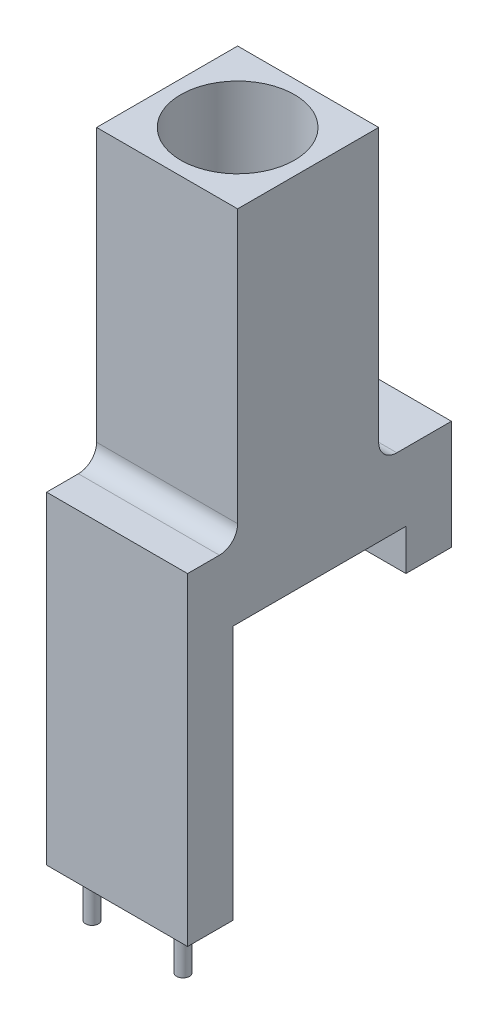
ISO-10303-21;
HEADER;
FILE_DESCRIPTION(('STEP AP214'),'2;1');
FILE_NAME('part.step','',(''),(''),'','','');
FILE_SCHEMA(('AUTOMOTIVE_DESIGN { 1 0 10303 214 1 1 1 1 }'));
ENDSEC;
DATA;
#1=APPLICATION_CONTEXT('core data for automotive mechanical design processes');
#2=APPLICATION_PROTOCOL_DEFINITION('international standard','automotive_design',2000,#1);
#3=PRODUCT_CONTEXT('',#1,'mechanical');
#4=PRODUCT('Part','Part','',(#3));
#5=PRODUCT_RELATED_PRODUCT_CATEGORY('part','',(#4));
#6=PRODUCT_DEFINITION_FORMATION('','',#4);
#7=PRODUCT_DEFINITION_CONTEXT('part definition',#1,'design');
#8=PRODUCT_DEFINITION('design','',#6,#7);
#9=PRODUCT_DEFINITION_SHAPE('','',#8);
#10=(LENGTH_UNIT() NAMED_UNIT(*) SI_UNIT(.MILLI.,.METRE.));
#11=(NAMED_UNIT(*) PLANE_ANGLE_UNIT() SI_UNIT($,.RADIAN.));
#12=(NAMED_UNIT(*) SI_UNIT($,.STERADIAN.) SOLID_ANGLE_UNIT());
#13=UNCERTAINTY_MEASURE_WITH_UNIT(LENGTH_MEASURE(1.E-05),#10,'distance_accuracy_value','');
#14=(GEOMETRIC_REPRESENTATION_CONTEXT(3) GLOBAL_UNCERTAINTY_ASSIGNED_CONTEXT((#13)) GLOBAL_UNIT_ASSIGNED_CONTEXT((#10,
#11,#12)) REPRESENTATION_CONTEXT('',''));
#15=CARTESIAN_POINT('',(0.,0.,0.));
#16=DIRECTION('',(0.,0.,1.));
#17=DIRECTION('',(1.,0.,0.));
#18=AXIS2_PLACEMENT_3D('',#15,#16,#17);
#19=CARTESIAN_POINT('',(15.5,28.5657137141714,-16.));
#20=DIRECTION('',(0.,1.,0.));
#21=DIRECTION('',(0.,0.,1.));
#22=AXIS2_PLACEMENT_3D('',#19,#20,#21);
#23=PLANE('',#22);
#24=DIRECTION('',(-1.,0.,0.));
#25=VECTOR('',#24,1.);
#26=CARTESIAN_POINT('',(-15.5,28.5657137141714,-6.));
#27=LINE('',#26,#25);
#28=CARTESIAN_POINT('',(15.5,28.5657137141714,-6.));
#29=VERTEX_POINT('',#28);
#30=CARTESIAN_POINT('',(-15.5,28.5657137141714,-6.));
#31=VERTEX_POINT('',#30);
#32=EDGE_CURVE('E173',#29,#31,#27,.T.);
#33=ORIENTED_EDGE('',*,*,#32,.F.);
#34=DIRECTION('',(0.,0.,1.));
#35=VECTOR('',#34,1.);
#36=CARTESIAN_POINT('',(15.5,28.5657137141714,-16.));
#37=LINE('',#36,#35);
#38=CARTESIAN_POINT('',(15.5,28.5657137141714,0.));
#39=VERTEX_POINT('',#38);
#40=EDGE_CURVE('E193',#29,#39,#37,.T.);
#41=ORIENTED_EDGE('',*,*,#40,.T.);
#42=DIRECTION('',(-1.,0.,0.));
#43=VECTOR('',#42,1.);
#44=CARTESIAN_POINT('',(15.5,28.5657137141714,0.));
#45=LINE('',#44,#43);
#46=CARTESIAN_POINT('',(-15.5,28.5657137141714,0.));
#47=VERTEX_POINT('',#46);
#48=EDGE_CURVE('E183',#39,#47,#45,.T.);
#49=ORIENTED_EDGE('',*,*,#48,.T.);
#50=DIRECTION('',(0.,0.,1.));
#51=VECTOR('',#50,1.);
#52=CARTESIAN_POINT('',(-15.5,28.5657137141714,-16.));
#53=LINE('',#52,#51);
#54=EDGE_CURVE('E191',#31,#47,#53,.T.);
#55=ORIENTED_EDGE('',*,*,#54,.F.);
#56=EDGE_LOOP('',(#33,#41,#49,#55));
#57=FACE_BOUND('',#56,.T.);
#58=ADVANCED_FACE('F37',(#57),#23,.F.);
#59=CARTESIAN_POINT('',(0.,0.,0.));
#60=DIRECTION('',(0.,0.,1.));
#61=DIRECTION('',(1.,0.,0.));
#62=AXIS2_PLACEMENT_3D('',#59,#60,#61);
#63=PLANE('',#62);
#64=DIRECTION('',(0.,1.,0.));
#65=VECTOR('',#64,1.);
#66=CARTESIAN_POINT('',(15.5,28.5657137141714,0.));
#67=LINE('',#66,#65);
#68=CARTESIAN_POINT('',(15.5,47.5657137141714,0.));
#69=VERTEX_POINT('',#68);
#70=CARTESIAN_POINT('',(15.5,107.5,0.));
#71=VERTEX_POINT('',#70);
#72=EDGE_CURVE('E252',#69,#71,#67,.T.);
#73=ORIENTED_EDGE('',*,*,#72,.F.);
#74=DIRECTION('',(1.,0.,0.));
#75=VECTOR('',#74,1.);
#76=CARTESIAN_POINT('',(-15.5,47.5657137141714,0.));
#77=LINE('',#76,#75);
#78=CARTESIAN_POINT('',(-15.5,47.5657137141714,0.));
#79=VERTEX_POINT('',#78);
#80=EDGE_CURVE('E58',#69,#79,#77,.F.);
#81=ORIENTED_EDGE('',*,*,#80,.T.);
#82=DIRECTION('',(0.,-1.,0.));
#83=VECTOR('',#82,1.);
#84=CARTESIAN_POINT('',(-15.5,107.5,0.));
#85=LINE('',#84,#83);
#86=CARTESIAN_POINT('',(-15.5,107.5,0.));
#87=VERTEX_POINT('',#86);
#88=EDGE_CURVE('E264',#87,#79,#85,.T.);
#89=ORIENTED_EDGE('',*,*,#88,.F.);
#90=DIRECTION('',(-1.,0.,0.));
#91=VECTOR('',#90,1.);
#92=CARTESIAN_POINT('',(15.5,107.5,0.));
#93=LINE('',#92,#91);
#94=EDGE_CURVE('E261',#71,#87,#93,.T.);
#95=ORIENTED_EDGE('',*,*,#94,.F.);
#96=EDGE_LOOP('',(#73,#81,#89,#95));
#97=FACE_BOUND('',#96,.T.);
#98=ADVANCED_FACE('F308',(#97),#63,.F.);
#99=CARTESIAN_POINT('',(-15.5,28.5657137141714,42.));
#100=DIRECTION('',(0.,1.,0.));
#101=DIRECTION('',(0.,0.,1.));
#102=AXIS2_PLACEMENT_3D('',#99,#100,#101);
#103=PLANE('',#102);
#104=DIRECTION('',(1.,0.,0.));
#105=VECTOR('',#104,1.);
#106=CARTESIAN_POINT('',(-15.5,28.5657137141714,32.));
#107=LINE('',#106,#105);
#108=CARTESIAN_POINT('',(-15.5,28.5657137141714,32.));
#109=VERTEX_POINT('',#108);
#110=CARTESIAN_POINT('',(15.5,28.5657137141714,32.));
#111=VERTEX_POINT('',#110);
#112=EDGE_CURVE('E205',#109,#111,#107,.T.);
#113=ORIENTED_EDGE('',*,*,#112,.F.);
#114=DIRECTION('',(0.,0.,-1.));
#115=VECTOR('',#114,1.);
#116=CARTESIAN_POINT('',(-15.5,28.5657137141714,42.));
#117=LINE('',#116,#115);
#118=CARTESIAN_POINT('',(-15.5,28.5657137141714,31.));
#119=VERTEX_POINT('',#118);
#120=EDGE_CURVE('E242',#109,#119,#117,.T.);
#121=ORIENTED_EDGE('',*,*,#120,.T.);
#122=DIRECTION('',(1.,0.,0.));
#123=VECTOR('',#122,1.);
#124=CARTESIAN_POINT('',(-15.5,28.5657137141714,31.));
#125=LINE('',#124,#123);
#126=CARTESIAN_POINT('',(15.5,28.5657137141714,31.));
#127=VERTEX_POINT('',#126);
#128=EDGE_CURVE('E225',#119,#127,#125,.T.);
#129=ORIENTED_EDGE('',*,*,#128,.T.);
#130=DIRECTION('',(0.,0.,-1.));
#131=VECTOR('',#130,1.);
#132=CARTESIAN_POINT('',(15.5,28.5657137141714,42.));
#133=LINE('',#132,#131);
#134=EDGE_CURVE('E240',#111,#127,#133,.T.);
#135=ORIENTED_EDGE('',*,*,#134,.F.);
#136=EDGE_LOOP('',(#113,#121,#129,#135));
#137=FACE_BOUND('',#136,.T.);
#138=ADVANCED_FACE('F302',(#137),#103,.F.);
#139=CARTESIAN_POINT('',(15.5,107.5,31.));
#140=DIRECTION('',(0.,-1.,0.));
#141=DIRECTION('',(0.,0.,-1.));
#142=AXIS2_PLACEMENT_3D('',#139,#140,#141);
#143=PLANE('',#142);
#144=CARTESIAN_POINT('',(0.,107.5,15.5));
#145=DIRECTION('',(0.,1.,0.));
#146=DIRECTION('',(0.,0.,1.));
#147=AXIS2_PLACEMENT_3D('',#144,#145,#146);
#148=CIRCLE('',#147,12.5);
#149=CARTESIAN_POINT('',(0.,107.5,28.));
#150=VERTEX_POINT('',#149);
#151=EDGE_CURVE('E244',#150,#150,#148,.T.);
#152=ORIENTED_EDGE('',*,*,#151,.F.);
#153=EDGE_LOOP('',(#152));
#154=FACE_BOUND('',#153,.T.);
#155=ORIENTED_EDGE('',*,*,#94,.T.);
#156=DIRECTION('',(0.,0.,-1.));
#157=VECTOR('',#156,1.);
#158=CARTESIAN_POINT('',(-15.5,107.5,31.));
#159=LINE('',#158,#157);
#160=CARTESIAN_POINT('',(-15.5,107.5,31.));
#161=VERTEX_POINT('',#160);
#162=EDGE_CURVE('E278',#161,#87,#159,.T.);
#163=ORIENTED_EDGE('',*,*,#162,.F.);
#164=DIRECTION('',(-1.,0.,0.));
#165=VECTOR('',#164,1.);
#166=CARTESIAN_POINT('',(15.5,107.5,31.));
#167=LINE('',#166,#165);
#168=CARTESIAN_POINT('',(15.5,107.5,31.));
#169=VERTEX_POINT('',#168);
#170=EDGE_CURVE('E248',#169,#161,#167,.T.);
#171=ORIENTED_EDGE('',*,*,#170,.F.);
#172=DIRECTION('',(0.,0.,-1.));
#173=VECTOR('',#172,1.);
#174=CARTESIAN_POINT('',(15.5,107.5,31.));
#175=LINE('',#174,#173);
#176=EDGE_CURVE('E260',#169,#71,#175,.T.);
#177=ORIENTED_EDGE('',*,*,#176,.T.);
#178=EDGE_LOOP('',(#155,#163,#171,#177));
#179=FACE_BOUND('',#178,.T.);
#180=ADVANCED_FACE('F384',(#154,#179),#143,.F.);
#181=CARTESIAN_POINT('',(-15.5,107.5,31.));
#182=DIRECTION('',(1.,0.,0.));
#183=DIRECTION('',(0.,1.,0.));
#184=AXIS2_PLACEMENT_3D('',#181,#182,#183);
#185=PLANE('',#184);
#186=ORIENTED_EDGE('',*,*,#88,.T.);
#187=CARTESIAN_POINT('',(-15.5,47.5657137141714,-4.));
#188=DIRECTION('',(1.,0.,0.));
#189=DIRECTION('',(0.,1.,0.));
#190=AXIS2_PLACEMENT_3D('',#187,#188,#189);
#191=CIRCLE('',#190,4.);
#192=CARTESIAN_POINT('',(-15.5,43.5657137141714,-4.));
#193=VERTEX_POINT('',#192);
#194=EDGE_CURVE('E11',#79,#193,#191,.T.);
#195=ORIENTED_EDGE('',*,*,#194,.T.);
#196=DIRECTION('',(0.,0.,1.));
#197=VECTOR('',#196,1.);
#198=CARTESIAN_POINT('',(-15.5,43.5657137141714,-16.));
#199=LINE('',#198,#197);
#200=CARTESIAN_POINT('',(-15.5,43.5657137141714,-16.));
#201=VERTEX_POINT('',#200);
#202=EDGE_CURVE('E155',#201,#193,#199,.T.);
#203=ORIENTED_EDGE('',*,*,#202,.F.);
#204=DIRECTION('',(0.,1.,0.));
#205=VECTOR('',#204,1.);
#206=CARTESIAN_POINT('',(-15.5,28.5657137141714,-16.));
#207=LINE('',#206,#205);
#208=CARTESIAN_POINT('',(-15.5,19.5657137141714,-16.));
#209=VERTEX_POINT('',#208);
#210=EDGE_CURVE('E148',#209,#201,#207,.T.);
#211=ORIENTED_EDGE('',*,*,#210,.F.);
#212=DIRECTION('',(0.,0.,-1.));
#213=VECTOR('',#212,1.);
#214=CARTESIAN_POINT('',(-15.5,19.5657137141714,-16.));
#215=LINE('',#214,#213);
#216=CARTESIAN_POINT('',(-15.5,19.5657137141714,-6.));
#217=VERTEX_POINT('',#216);
#218=EDGE_CURVE('E153',#217,#209,#215,.T.);
#219=ORIENTED_EDGE('',*,*,#218,.F.);
#220=DIRECTION('',(0.,1.,0.));
#221=VECTOR('',#220,1.);
#222=CARTESIAN_POINT('',(-15.5,19.5657137141714,-6.));
#223=LINE('',#222,#221);
#224=EDGE_CURVE('E178',#217,#31,#223,.T.);
#225=ORIENTED_EDGE('',*,*,#224,.T.);
#226=ORIENTED_EDGE('',*,*,#54,.T.);
#227=DIRECTION('',(0.,0.,-1.));
#228=VECTOR('',#227,1.);
#229=CARTESIAN_POINT('',(-15.5,28.5657137141714,31.));
#230=LINE('',#229,#228);
#231=EDGE_CURVE('E275',#119,#47,#230,.T.);
#232=ORIENTED_EDGE('',*,*,#231,.F.);
#233=ORIENTED_EDGE('',*,*,#120,.F.);
#234=DIRECTION('',(0.,1.,0.));
#235=VECTOR('',#234,1.);
#236=CARTESIAN_POINT('',(-15.5,-27.4342862858286,32.));
#237=LINE('',#236,#235);
#238=CARTESIAN_POINT('',(-15.5,-27.4342862858286,32.));
#239=VERTEX_POINT('',#238);
#240=EDGE_CURVE('E223',#239,#109,#237,.T.);
#241=ORIENTED_EDGE('',*,*,#240,.F.);
#242=DIRECTION('',(0.,0.,-1.));
#243=VECTOR('',#242,1.);
#244=CARTESIAN_POINT('',(-15.5,-27.4342862858286,42.));
#245=LINE('',#244,#243);
#246=CARTESIAN_POINT('',(-15.5,-27.4342862858286,42.));
#247=VERTEX_POINT('',#246);
#248=EDGE_CURVE('E208',#247,#239,#245,.T.);
#249=ORIENTED_EDGE('',*,*,#248,.F.);
#250=DIRECTION('',(0.,-1.,0.));
#251=VECTOR('',#250,1.);
#252=CARTESIAN_POINT('',(-15.5,43.5657137141714,42.));
#253=LINE('',#252,#251);
#254=CARTESIAN_POINT('',(-15.5,43.5657137141714,42.));
#255=VERTEX_POINT('',#254);
#256=EDGE_CURVE('E226',#255,#247,#253,.T.);
#257=ORIENTED_EDGE('',*,*,#256,.F.);
#258=DIRECTION('',(0.,0.,-1.));
#259=VECTOR('',#258,1.);
#260=CARTESIAN_POINT('',(-15.5,43.5657137141714,42.));
#261=LINE('',#260,#259);
#262=CARTESIAN_POINT('',(-15.5,43.5657137141714,35.));
#263=VERTEX_POINT('',#262);
#264=EDGE_CURVE('E232',#255,#263,#261,.T.);
#265=ORIENTED_EDGE('',*,*,#264,.T.);
#266=CARTESIAN_POINT('',(-15.5,47.5657137141714,35.));
#267=DIRECTION('',(1.,0.,0.));
#268=DIRECTION('',(0.,1.,0.));
#269=AXIS2_PLACEMENT_3D('',#266,#267,#268);
#270=CIRCLE('',#269,4.);
#271=CARTESIAN_POINT('',(-15.5,47.5657137141714,31.));
#272=VERTEX_POINT('',#271);
#273=EDGE_CURVE('E371',#263,#272,#270,.T.);
#274=ORIENTED_EDGE('',*,*,#273,.T.);
#275=DIRECTION('',(0.,-1.,0.));
#276=VECTOR('',#275,1.);
#277=CARTESIAN_POINT('',(-15.5,107.5,31.));
#278=LINE('',#277,#276);
#279=EDGE_CURVE('E251',#161,#272,#278,.T.);
#280=ORIENTED_EDGE('',*,*,#279,.F.);
#281=ORIENTED_EDGE('',*,*,#162,.T.);
#282=EDGE_LOOP('',(#186,#195,#203,#211,#219,#225,#226,#232,#233,#241,#249,#257,#265,#274,#280,#281));
#283=FACE_BOUND('',#282,.T.);
#284=ADVANCED_FACE('F150',(#283),#185,.F.);
#285=CARTESIAN_POINT('',(0.,0.,31.));
#286=DIRECTION('',(0.,0.,-1.));
#287=DIRECTION('',(-1.,0.,0.));
#288=AXIS2_PLACEMENT_3D('',#285,#286,#287);
#289=CYLINDRICAL_SURFACE('',#288,32.5);
#290=CARTESIAN_POINT('',(0.,32.5,28.));
#291=CARTESIAN_POINT('',(0.337836576797096,32.5000014858481,28.000001993995));
#292=CARTESIAN_POINT('',(0.675646419073798,32.4947211701503,27.9862937420786));
#293=CARTESIAN_POINT('',(1.34870111968519,32.4737482365528,27.9316118089023));
#294=CARTESIAN_POINT('',(1.68394624124221,32.4580567020813,27.8906409646826));
#295=CARTESIAN_POINT('',(2.34934871452611,32.4166882439333,27.7818646195122));
#296=CARTESIAN_POINT('',(2.67950706401439,32.3910133050893,27.7140644525374));
#297=CARTESIAN_POINT('',(3.33247627680054,32.3303591796677,27.5522920170705));
#298=CARTESIAN_POINT('',(3.655286909019,32.2953797009079,27.458318926689));
#299=CARTESIAN_POINT('',(4.29072361432594,32.2171068201874,27.2452866472738));
#300=CARTESIAN_POINT('',(4.60336922914889,32.1738306278612,27.1262793371601));
#301=CARTESIAN_POINT('',(5.21720005388813,32.0800129844634,26.8640755743457));
#302=CARTESIAN_POINT('',(5.51838536540989,32.029471597823,26.7208793361621));
#303=CARTESIAN_POINT('',(6.10753812636798,31.9223688998614,26.4114025835071));
#304=CARTESIAN_POINT('',(6.39550504684375,31.865807347931,26.2451211463047));
#305=CARTESIAN_POINT('',(6.95671971310771,31.7480126441507,25.8905854655627));
#306=CARTESIAN_POINT('',(7.22996167002814,31.6867776775584,25.7023226712112));
#307=CARTESIAN_POINT('',(7.7706537047966,31.5586304930565,25.2972200692385));
#308=CARTESIAN_POINT('',(8.03744733335522,31.4915895245141,25.0795445345004));
#309=CARTESIAN_POINT('',(8.55205593114125,31.3557523561662,24.6230858010536));
#310=CARTESIAN_POINT('',(8.79986216610441,31.2869553677547,24.3842929958416));
#311=CARTESIAN_POINT('',(9.27504004475683,31.1493955036273,23.8870100841506));
#312=CARTESIAN_POINT('',(9.50240511349479,31.0806326459122,23.628513689016));
#313=CARTESIAN_POINT('',(9.93516777355413,30.9450133423428,23.0934696553564));
#314=CARTESIAN_POINT('',(10.140574929647,30.8781560758053,22.8169299616453));
#315=CARTESIAN_POINT('',(10.5361926192171,30.7454705238633,22.2355247309291));
#316=CARTESIAN_POINT('',(10.7254328950547,30.6797972013217,21.929962362477));
#317=CARTESIAN_POINT('',(11.0772837609268,30.5545195371022,21.3028437932912));
#318=CARTESIAN_POINT('',(11.2399052407247,30.4949127174085,20.9812942034822));
#319=CARTESIAN_POINT('',(11.537197149669,30.3836845618775,20.3242192093027));
#320=CARTESIAN_POINT('',(11.6718706236739,30.3320623562946,19.9886953321798));
#321=CARTESIAN_POINT('',(11.9119727513701,30.2385768319002,19.3060217615066));
#322=CARTESIAN_POINT('',(12.0174032216406,30.1967129069289,18.9588727916107));
#323=CARTESIAN_POINT('',(12.1940327024765,30.125806828917,18.2706223819346));
#324=CARTESIAN_POINT('',(12.2665005265636,30.0962937506804,17.9298950679498));
#325=CARTESIAN_POINT('',(12.3828123832685,30.0486260105227,17.242798675196));
#326=CARTESIAN_POINT('',(12.4266571846729,30.0304710435341,16.8964297482112));
#327=CARTESIAN_POINT('',(12.4852075673048,30.0061760528473,16.2009482804609));
#328=CARTESIAN_POINT('',(12.4999242032444,30.0000314709825,15.851836831059));
#329=CARTESIAN_POINT('',(12.5000752025603,29.9999687768108,15.1536139337828));
#330=CARTESIAN_POINT('',(12.4855107857316,30.0060501551928,14.8045024865141));
#331=CARTESIAN_POINT('',(12.429132566831,30.0294439685778,14.1312699315952));
#332=CARTESIAN_POINT('',(12.3891100686744,30.0460177856045,13.8069711336992));
#333=CARTESIAN_POINT('',(12.2839560314935,30.0891616788465,13.1631642014051));
#334=CARTESIAN_POINT('',(12.2188257177663,30.1157312672523,12.8436558340177));
#335=CARTESIAN_POINT('',(12.064070266564,30.1780574892286,12.2115176237259));
#336=CARTESIAN_POINT('',(11.9744423853936,30.2138151518245,11.8988885555344));
#337=CARTESIAN_POINT('',(11.7714864797709,30.293464264234,11.2824886545358));
#338=CARTESIAN_POINT('',(11.6581576468484,30.3373559915053,10.9787181243079));
#339=CARTESIAN_POINT('',(11.4063068130956,30.4329532504431,10.3760489499068));
#340=CARTESIAN_POINT('',(11.2673412010473,30.4847931208213,10.077357163428));
#341=CARTESIAN_POINT('',(10.966727823749,30.5942227078782,9.49258707899246));
#342=CARTESIAN_POINT('',(10.8050717568344,30.6518145267645,9.20651344816111));
#343=CARTESIAN_POINT('',(10.4601861792418,30.7712170242723,8.6485709981369));
#344=CARTESIAN_POINT('',(10.2769543429051,30.8330281573926,8.37670371481884));
#345=CARTESIAN_POINT('',(9.89004205510004,30.9593035374755,7.84857949317793));
#346=CARTESIAN_POINT('',(9.68636062950952,31.0237679107395,7.59232329942892));
#347=CARTESIAN_POINT('',(9.24446718324196,31.1584161029858,7.07904233153633));
#348=CARTESIAN_POINT('',(9.00482867272834,31.2286800574564,6.8232649088032));
#349=CARTESIAN_POINT('',(8.50493372666239,31.3685101409535,6.33273832107719));
#350=CARTESIAN_POINT('',(8.24468559639744,31.4380765384775,6.09798076591755));
#351=CARTESIAN_POINT('',(7.70483283836485,31.5747226511574,5.65071118147546));
#352=CARTESIAN_POINT('',(7.42521665158465,31.6418008440226,5.43821262992373));
#353=CARTESIAN_POINT('',(6.84852311496038,31.771607462917,5.03715940513001));
#354=CARTESIAN_POINT('',(6.55145291574591,31.8343376476115,4.84859502513062));
#355=CARTESIAN_POINT('',(5.93625996496472,31.9548233059178,4.4936797074902));
#356=CARTESIAN_POINT('',(5.61786180256933,32.0124738683296,4.32776979618448));
#357=CARTESIAN_POINT('',(4.96685522977237,32.1199186127321,4.02352681167766));
#358=CARTESIAN_POINT('',(4.63424653718921,32.1697126386216,3.88519428639604));
#359=CARTESIAN_POINT('',(3.95732331030257,32.2599771617885,3.63747776509059));
#360=CARTESIAN_POINT('',(3.61301326443366,32.300451188749,3.52808280744804));
#361=CARTESIAN_POINT('',(2.91521092744542,32.370889364124,3.33931913715329));
#362=CARTESIAN_POINT('',(2.56171921966379,32.4008541784737,3.25994852192951));
#363=CARTESIAN_POINT('',(1.86822654149732,32.4480160606902,3.13566196416776));
#364=CARTESIAN_POINT('',(1.52856560402226,32.4658294122302,3.08907834234039));
#365=CARTESIAN_POINT('',(0.846177822415279,32.4907760537283,3.02396536204923));
#366=CARTESIAN_POINT('',(0.503451092196715,32.4979097388581,3.00543496555238));
#367=CARTESIAN_POINT('',(-0.18234638558213,32.5012971160742,2.99662728409562));
#368=CARTESIAN_POINT('',(-0.525417047665262,32.4975530506074,3.00634417596132));
#369=CARTESIAN_POINT('',(-1.20930851007697,32.4792945740625,3.05391389996297));
#370=CARTESIAN_POINT('',(-1.55012934778272,32.4647803423699,3.09176626348092));
#371=CARTESIAN_POINT('',(-2.21305573781644,32.4261945922102,3.19308386801296));
#372=CARTESIAN_POINT('',(-2.53535633529605,32.4025385760353,3.2554373415451));
#373=CARTESIAN_POINT('',(-3.17330734732858,32.3462927567292,3.40506473925271));
#374=CARTESIAN_POINT('',(-3.48895798981923,32.3137032603453,3.49233780777246));
#375=CARTESIAN_POINT('',(-4.11160846214195,32.2403933537209,3.69104216297893));
#376=CARTESIAN_POINT('',(-4.41860758802012,32.1996722840003,3.80247540914692));
#377=CARTESIAN_POINT('',(-5.0220758323634,32.1110849542513,4.04858300475126));
#378=CARTESIAN_POINT('',(-5.31854459692326,32.0632184543593,4.18325813441326));
#379=CARTESIAN_POINT('',(-5.90788780672696,31.9599593197607,4.4791657077339));
#380=CARTESIAN_POINT('',(-6.20039403196736,31.9043853909989,4.64106807003787));
#381=CARTESIAN_POINT('',(-6.77089024325919,31.7882027513973,4.98732028569481));
#382=CARTESIAN_POINT('',(-7.04887479299824,31.7275921767349,5.17167846073493));
#383=CARTESIAN_POINT('',(-7.5887545349965,31.6028097457927,5.56160479328448));
#384=CARTESIAN_POINT('',(-7.85064743289137,31.5386373841408,5.76717596422032));
#385=CARTESIAN_POINT('',(-8.35693289915545,31.4082794568399,6.19826757178262));
#386=CARTESIAN_POINT('',(-8.60132478091287,31.3420938123494,6.42378879032791));
#387=CARTESIAN_POINT('',(-9.0857504740377,31.2052290218407,6.90794067673282));
#388=CARTESIAN_POINT('',(-9.3245965278678,31.1345233678042,7.16775387326328));
#389=CARTESIAN_POINT('',(-9.77955606416925,30.9946272278478,7.70675842068411));
#390=CARTESIAN_POINT('',(-9.99567902379111,30.9254361198645,7.98594161161521));
#391=CARTESIAN_POINT('',(-10.4040109365392,30.7904666087189,8.5623232137296));
#392=CARTESIAN_POINT('',(-10.5962059566684,30.7246902067803,8.85953197262626));
#393=CARTESIAN_POINT('',(-10.9550625967691,30.598574740042,9.46991856158089));
#394=CARTESIAN_POINT('',(-11.1217351197363,30.5382333580096,9.78308949609661));
#395=CARTESIAN_POINT('',(-11.4292730930952,30.4244768010409,10.4256161603052));
#396=CARTESIAN_POINT('',(-11.5699665785565,30.3711084179073,10.7550626333341));
#397=CARTESIAN_POINT('',(-11.8229161820429,30.2735371507908,11.4260351589831));
#398=CARTESIAN_POINT('',(-11.9351719982129,30.2293343640982,11.7675613397809));
#399=CARTESIAN_POINT('',(-12.1300251663235,30.1516749468945,12.4599734163671));
#400=CARTESIAN_POINT('',(-12.2126389587628,30.1182123605837,12.8108540074911));
#401=CARTESIAN_POINT('',(-12.347347462325,30.0632388267647,13.5193422493093));
#402=CARTESIAN_POINT('',(-12.3994444593826,30.0417269840631,13.876949394063));
#403=CARTESIAN_POINT('',(-12.4700355860757,30.0124899541665,14.5716686201911));
#404=CARTESIAN_POINT('',(-12.4905540874282,30.0039348248892,14.9085414958595));
#405=CARTESIAN_POINT('',(-12.5042733999444,29.9982201271177,15.5829323221159));
#406=CARTESIAN_POINT('',(-12.4974754902856,30.0010600250152,15.9204502417579));
#407=CARTESIAN_POINT('',(-12.4566410320723,30.0180375072707,16.5935076797743));
#408=CARTESIAN_POINT('',(-12.4226072060802,30.0321739623997,16.9290473925175));
#409=CARTESIAN_POINT('',(-12.3276744203618,30.0712665333475,17.5956596040771));
#410=CARTESIAN_POINT('',(-12.2667755151395,30.0962226272155,17.9267321119551));
#411=CARTESIAN_POINT('',(-12.1212692462898,30.1551116456071,18.5708494113773));
#412=CARTESIAN_POINT('',(-12.0375402984542,30.1887097692855,18.8841241132371));
#413=CARTESIAN_POINT('',(-11.8463246437013,30.2642553807919,19.5024173941431));
#414=CARTESIAN_POINT('',(-11.7388294874756,30.3062058374936,19.8074329935344));
#415=CARTESIAN_POINT('',(-11.501003763072,30.3972549424326,20.4072374016636));
#416=CARTESIAN_POINT('',(-11.3706779063604,30.4463521154822,20.7020283054172));
#417=CARTESIAN_POINT('',(-11.0880766958676,30.5504046976091,21.2799725025733));
#418=CARTESIAN_POINT('',(-10.9357913603118,30.6053627678072,21.5631204279804));
#419=CARTESIAN_POINT('',(-10.6014757544643,30.7228217147294,22.1312259001551));
#420=CARTESIAN_POINT('',(-10.4182790286402,30.7855701603389,22.4154461547296));
#421=CARTESIAN_POINT('',(-10.0299458981895,30.9142685538483,22.9675332775858));
#422=CARTESIAN_POINT('',(-9.82481763482346,30.9802173088228,23.2354061566135));
#423=CARTESIAN_POINT('',(-9.39365602037941,31.113665404182,23.7536610585337));
#424=CARTESIAN_POINT('',(-9.16760890820722,31.1811657429909,24.0040313748607));
#425=CARTESIAN_POINT('',(-8.696082385407,31.3159424571287,24.4856379580709));
#426=CARTESIAN_POINT('',(-8.45060949727746,31.3832188997944,24.7168805944731));
#427=CARTESIAN_POINT('',(-7.92660987150273,31.5197772050651,25.1719275168523));
#428=CARTESIAN_POINT('',(-7.64699001785467,31.5889467722863,25.3945089625188));
#429=CARTESIAN_POINT('',(-7.0690734930213,31.7232753869772,25.8153271264768));
#430=CARTESIAN_POINT('',(-6.77077634855599,31.7884343327354,26.0135632274834));
#431=CARTESIAN_POINT('',(-6.15729613308856,31.9129388230043,26.3842156738373));
#432=CARTESIAN_POINT('',(-5.84210974945129,31.9722832205527,26.556626928576));
#433=CARTESIAN_POINT('',(-5.19697196812804,32.0834633977846,26.8741259529693));
#434=CARTESIAN_POINT('',(-4.86702007342906,32.1352989244674,27.0192128020161));
#435=CARTESIAN_POINT('',(-4.17264073325585,32.2330552453392,27.2892638928707));
#436=CARTESIAN_POINT('',(-3.80737026888949,32.2783668866657,27.4122896453467));
#437=CARTESIAN_POINT('',(-3.06581046120039,32.3572222779021,27.624336296155));
#438=CARTESIAN_POINT('',(-2.68952032228379,32.3907651758565,27.7133547326927));
#439=CARTESIAN_POINT('',(-1.9295825115482,32.444903163824,27.8562176902785));
#440=CARTESIAN_POINT('',(-1.54593846561329,32.4655044737244,27.9100791087115));
#441=CARTESIAN_POINT('',(-0.774850858737181,32.4930510592465,27.9819665469636));
#442=CARTESIAN_POINT('',(-0.387407851512583,32.4999982961312,27.9999977134231));
#443=CARTESIAN_POINT('',(0.,32.5,28.));
#444=B_SPLINE_CURVE_WITH_KNOTS('',3,(#290,#291,#292,#293,#294,#295,#296,#297,#298,#299,#300,
#301,#302,#303,#304,#305,#306,#307,#308,#309,#310,#311,#312,#313,#314,#315,#316,#317,#318,#319,
#320,#321,#322,#323,#324,#325,#326,#327,#328,#329,#330,#331,#332,#333,#334,#335,#336,#337,#338,
#339,#340,#341,#342,#343,#344,#345,#346,#347,#348,#349,#350,#351,#352,#353,#354,#355,#356,#357,
#358,#359,#360,#361,#362,#363,#364,#365,#366,#367,#368,#369,#370,#371,#372,#373,#374,#375,#376,
#377,#378,#379,#380,#381,#382,#383,#384,#385,#386,#387,#388,#389,#390,#391,#392,#393,#394,#395,
#396,#397,#398,#399,#400,#401,#402,#403,#404,#405,#406,#407,#408,#409,#410,#411,#412,#413,#414,
#415,#416,#417,#418,#419,#420,#421,#422,#423,#424,#425,#426,#427,#428,#429,#430,#431,#432,#433,
#434,#435,#436,#437,#438,#439,#440,#441,#442,#443),.UNSPECIFIED.,.T.,.F.,(4,2,2,2,2,2,2,2,2,2,2,
2,2,2,2,2,2,2,2,2,2,2,2,2,2,2,2,2,2,2,2,2,2,2,2,2,2,2,2,2,2,2,2,2,2,2,2,2,2,2,2,2,2,2,2,2,2,2,2,
2,2,2,2,2,2,2,2,2,2,2,2,2,2,2,2,2,4),(0.,1.01314595975048,2.02618650449893,3.03902574631696,
4.05189679717286,5.06268917606959,6.07347259133179,7.08429641992878,8.09551478028225,
9.14672589398078,10.1984177008507,11.2504465856736,12.3020153277499,13.3967609426597,
14.4910575711259,15.5852349163197,16.6793442758452,17.726762896864,18.7741533840765,
19.82114628971,20.8680955804434,21.8484829808636,22.8288225430416,23.809271946983,
24.789754800777,25.7891419927472,26.7888957841688,27.7887574381648,28.7886667434743,
29.8598534845726,30.9306107330479,32.0020126176474,33.0729785859505,34.1624833832819,
35.2520098252111,36.3411229590213,37.4301670667424,38.4587723565712,39.4873395847373,
40.5156947889557,41.5440328655077,42.5302803600795,43.5164939942756,44.5027876440464,
45.4891144099522,46.5047330614098,47.5207292330266,48.5368699318705,49.5530504748226,
50.6315897362553,51.709677370463,52.7883898569161,53.8666402331481,54.9517903605402,
56.0369520059121,57.1215108490711,58.2059884403217,59.2175271330167,60.2290184577633,
61.2404086842304,62.2517968587977,63.2287277896937,64.2060065969525,65.1830839647583,
66.1606068755155,67.1912327772456,68.2214774174347,69.252404669877,70.2829872297012,
71.3737490421794,72.4645385056074,73.5555427039186,74.6465836535307,75.8090320001179,
76.9715644805817,78.1335378052259,79.2953442125035),.UNSPECIFIED.);
#445=CARTESIAN_POINT('',(0.,32.5,28.));
#446=VERTEX_POINT('',#445);
#447=EDGE_CURVE('E247',#446,#446,#444,.T.);
#448=ORIENTED_EDGE('',*,*,#447,.T.);
#449=EDGE_LOOP('',(#448));
#450=FACE_BOUND('',#449,.T.);
#451=CARTESIAN_POINT('',(0.,0.,0.));
#452=DIRECTION('',(0.,0.,-1.));
#453=DIRECTION('',(1.,0.,0.));
#454=AXIS2_PLACEMENT_3D('',#451,#452,#453);
#455=CIRCLE('',#454,32.5);
#456=EDGE_CURVE('E266',#47,#39,#455,.T.);
#457=ORIENTED_EDGE('',*,*,#456,.T.);
#458=DIRECTION('',(0.,0.,-1.));
#459=VECTOR('',#458,1.);
#460=CARTESIAN_POINT('',(15.5,28.5657137141714,31.));
#461=LINE('',#460,#459);
#462=EDGE_CURVE('E272',#127,#39,#461,.T.);
#463=ORIENTED_EDGE('',*,*,#462,.F.);
#464=CARTESIAN_POINT('',(0.,0.,31.));
#465=DIRECTION('',(0.,0.,-1.));
#466=DIRECTION('',(1.,0.,0.));
#467=AXIS2_PLACEMENT_3D('',#464,#465,#466);
#468=CIRCLE('',#467,32.5);
#469=EDGE_CURVE('E255',#119,#127,#468,.T.);
#470=ORIENTED_EDGE('',*,*,#469,.F.);
#471=ORIENTED_EDGE('',*,*,#231,.T.);
#472=EDGE_LOOP('',(#457,#463,#470,#471));
#473=FACE_BOUND('',#472,.T.);
#474=ADVANCED_FACE('F290',(#450,#473),#289,.F.);
#475=CARTESIAN_POINT('',(15.5,28.5657137141714,31.));
#476=DIRECTION('',(-1.,0.,0.));
#477=DIRECTION('',(0.,-1.,0.));
#478=AXIS2_PLACEMENT_3D('',#475,#476,#477);
#479=PLANE('',#478);
#480=ORIENTED_EDGE('',*,*,#462,.T.);
#481=ORIENTED_EDGE('',*,*,#40,.F.);
#482=DIRECTION('',(0.,1.,0.));
#483=VECTOR('',#482,1.);
#484=CARTESIAN_POINT('',(15.5,19.5657137141714,-6.));
#485=LINE('',#484,#483);
#486=CARTESIAN_POINT('',(15.5,19.5657137141714,-6.));
#487=VERTEX_POINT('',#486);
#488=EDGE_CURVE('E181',#487,#29,#485,.T.);
#489=ORIENTED_EDGE('',*,*,#488,.F.);
#490=DIRECTION('',(0.,0.,1.));
#491=VECTOR('',#490,1.);
#492=CARTESIAN_POINT('',(15.5,19.5657137141714,-16.));
#493=LINE('',#492,#491);
#494=CARTESIAN_POINT('',(15.5,19.5657137141714,-16.));
#495=VERTEX_POINT('',#494);
#496=EDGE_CURVE('E167',#495,#487,#493,.T.);
#497=ORIENTED_EDGE('',*,*,#496,.F.);
#498=DIRECTION('',(0.,-1.,0.));
#499=VECTOR('',#498,1.);
#500=CARTESIAN_POINT('',(15.5,28.5657137141714,-16.));
#501=LINE('',#500,#499);
#502=CARTESIAN_POINT('',(15.5,43.5657137141714,-16.));
#503=VERTEX_POINT('',#502);
#504=EDGE_CURVE('E159',#503,#495,#501,.T.);
#505=ORIENTED_EDGE('',*,*,#504,.F.);
#506=DIRECTION('',(0.,0.,1.));
#507=VECTOR('',#506,1.);
#508=CARTESIAN_POINT('',(15.5,43.5657137141714,-16.));
#509=LINE('',#508,#507);
#510=CARTESIAN_POINT('',(15.5,43.5657137141714,-4.));
#511=VERTEX_POINT('',#510);
#512=EDGE_CURVE('E186',#503,#511,#509,.T.);
#513=ORIENTED_EDGE('',*,*,#512,.T.);
#514=CARTESIAN_POINT('',(15.5,47.5657137141714,-4.));
#515=DIRECTION('',(-1.,0.,0.));
#516=DIRECTION('',(0.,-1.,0.));
#517=AXIS2_PLACEMENT_3D('',#514,#515,#516);
#518=CIRCLE('',#517,4.);
#519=EDGE_CURVE('E45',#511,#69,#518,.T.);
#520=ORIENTED_EDGE('',*,*,#519,.T.);
#521=ORIENTED_EDGE('',*,*,#72,.T.);
#522=ORIENTED_EDGE('',*,*,#176,.F.);
#523=DIRECTION('',(0.,1.,0.));
#524=VECTOR('',#523,1.);
#525=CARTESIAN_POINT('',(15.5,28.5657137141714,31.));
#526=LINE('',#525,#524);
#527=CARTESIAN_POINT('',(15.5,47.5657137141714,31.));
#528=VERTEX_POINT('',#527);
#529=EDGE_CURVE('E258',#528,#169,#526,.T.);
#530=ORIENTED_EDGE('',*,*,#529,.F.);
#531=CARTESIAN_POINT('',(15.5,47.5657137141714,35.));
#532=DIRECTION('',(-1.,0.,0.));
#533=DIRECTION('',(0.,-1.,0.));
#534=AXIS2_PLACEMENT_3D('',#531,#532,#533);
#535=CIRCLE('',#534,4.);
#536=CARTESIAN_POINT('',(15.5,43.5657137141714,35.));
#537=VERTEX_POINT('',#536);
#538=EDGE_CURVE('E370',#528,#537,#535,.T.);
#539=ORIENTED_EDGE('',*,*,#538,.T.);
#540=DIRECTION('',(0.,0.,-1.));
#541=VECTOR('',#540,1.);
#542=CARTESIAN_POINT('',(15.5,43.5657137141714,42.));
#543=LINE('',#542,#541);
#544=CARTESIAN_POINT('',(15.5,43.5657137141714,42.));
#545=VERTEX_POINT('',#544);
#546=EDGE_CURVE('E237',#545,#537,#543,.T.);
#547=ORIENTED_EDGE('',*,*,#546,.F.);
#548=DIRECTION('',(0.,1.,0.));
#549=VECTOR('',#548,1.);
#550=CARTESIAN_POINT('',(15.5,43.5657137141714,42.));
#551=LINE('',#550,#549);
#552=CARTESIAN_POINT('',(15.5,-27.4342862858286,42.));
#553=VERTEX_POINT('',#552);
#554=EDGE_CURVE('E228',#553,#545,#551,.T.);
#555=ORIENTED_EDGE('',*,*,#554,.F.);
#556=DIRECTION('',(0.,0.,1.));
#557=VECTOR('',#556,1.);
#558=CARTESIAN_POINT('',(15.5,-27.4342862858286,42.));
#559=LINE('',#558,#557);
#560=CARTESIAN_POINT('',(15.5,-27.4342862858286,32.));
#561=VERTEX_POINT('',#560);
#562=EDGE_CURVE('E213',#561,#553,#559,.T.);
#563=ORIENTED_EDGE('',*,*,#562,.F.);
#564=DIRECTION('',(0.,1.,0.));
#565=VECTOR('',#564,1.);
#566=CARTESIAN_POINT('',(15.5,-27.4342862858286,32.));
#567=LINE('',#566,#565);
#568=EDGE_CURVE('E219',#561,#111,#567,.T.);
#569=ORIENTED_EDGE('',*,*,#568,.T.);
#570=ORIENTED_EDGE('',*,*,#134,.T.);
#571=EDGE_LOOP('',(#480,#481,#489,#497,#505,#513,#520,#521,#522,#530,#539,#547,#555,#563,#569,#570));
#572=FACE_BOUND('',#571,.T.);
#573=ADVANCED_FACE('F306',(#572),#479,.F.);
#574=CARTESIAN_POINT('',(0.,0.,31.));
#575=DIRECTION('',(0.,0.,1.));
#576=DIRECTION('',(1.,0.,0.));
#577=AXIS2_PLACEMENT_3D('',#574,#575,#576);
#578=PLANE('',#577);
#579=ORIENTED_EDGE('',*,*,#279,.T.);
#580=DIRECTION('',(-1.,0.,0.));
#581=VECTOR('',#580,1.);
#582=CARTESIAN_POINT('',(0.,47.5657137141714,31.));
#583=LINE('',#582,#581);
#584=EDGE_CURVE('E372',#272,#528,#583,.F.);
#585=ORIENTED_EDGE('',*,*,#584,.T.);
#586=ORIENTED_EDGE('',*,*,#529,.T.);
#587=ORIENTED_EDGE('',*,*,#170,.T.);
#588=EDGE_LOOP('',(#579,#585,#586,#587));
#589=FACE_BOUND('',#588,.T.);
#590=ADVANCED_FACE('F300',(#589),#578,.T.);
#591=CARTESIAN_POINT('',(0.,28.5657137141714,15.5));
#592=DIRECTION('',(0.,1.,0.));
#593=DIRECTION('',(0.,0.,1.));
#594=AXIS2_PLACEMENT_3D('',#591,#592,#593);
#595=CYLINDRICAL_SURFACE('',#594,12.5);
#596=ORIENTED_EDGE('',*,*,#151,.T.);
#597=EDGE_LOOP('',(#596));
#598=FACE_BOUND('',#597,.T.);
#599=ORIENTED_EDGE('',*,*,#447,.F.);
#600=EDGE_LOOP('',(#599));
#601=FACE_BOUND('',#600,.T.);
#602=ADVANCED_FACE('F294',(#598,#601),#595,.F.);
#603=CARTESIAN_POINT('',(0.,0.,31.));
#604=DIRECTION('',(0.,0.,1.));
#605=DIRECTION('',(1.,0.,0.));
#606=AXIS2_PLACEMENT_3D('',#603,#604,#605);
#607=PLANE('',#606);
#608=ORIENTED_EDGE('',*,*,#128,.F.);
#609=ORIENTED_EDGE('',*,*,#469,.T.);
#610=EDGE_LOOP('',(#608,#609));
#611=FACE_BOUND('',#610,.T.);
#612=ADVANCED_FACE('F299',(#611),#607,.F.);
#613=CARTESIAN_POINT('',(-15.5,43.5657137141714,42.));
#614=DIRECTION('',(0.,-1.,0.));
#615=DIRECTION('',(0.,0.,-1.));
#616=AXIS2_PLACEMENT_3D('',#613,#614,#615);
#617=PLANE('',#616);
#618=ORIENTED_EDGE('',*,*,#546,.T.);
#619=DIRECTION('',(-1.,0.,0.));
#620=VECTOR('',#619,1.);
#621=CARTESIAN_POINT('',(-15.5,43.5657137141714,35.));
#622=LINE('',#621,#620);
#623=EDGE_CURVE('E281',#537,#263,#622,.T.);
#624=ORIENTED_EDGE('',*,*,#623,.T.);
#625=ORIENTED_EDGE('',*,*,#264,.F.);
#626=DIRECTION('',(-1.,0.,0.));
#627=VECTOR('',#626,1.);
#628=CARTESIAN_POINT('',(-15.5,43.5657137141714,42.));
#629=LINE('',#628,#627);
#630=EDGE_CURVE('E230',#545,#255,#629,.T.);
#631=ORIENTED_EDGE('',*,*,#630,.F.);
#632=EDGE_LOOP('',(#618,#624,#625,#631));
#633=FACE_BOUND('',#632,.T.);
#634=ADVANCED_FACE('F353',(#633),#617,.F.);
#635=CARTESIAN_POINT('',(0.,0.,42.));
#636=DIRECTION('',(0.,0.,1.));
#637=DIRECTION('',(1.,0.,0.));
#638=AXIS2_PLACEMENT_3D('',#635,#636,#637);
#639=PLANE('',#638);
#640=ORIENTED_EDGE('',*,*,#256,.T.);
#641=DIRECTION('',(-1.,0.,0.));
#642=VECTOR('',#641,1.);
#643=CARTESIAN_POINT('',(-15.5,-27.4342862858286,42.));
#644=LINE('',#643,#642);
#645=EDGE_CURVE('E216',#553,#247,#644,.T.);
#646=ORIENTED_EDGE('',*,*,#645,.F.);
#647=ORIENTED_EDGE('',*,*,#554,.T.);
#648=ORIENTED_EDGE('',*,*,#630,.T.);
#649=EDGE_LOOP('',(#640,#646,#647,#648));
#650=FACE_BOUND('',#649,.T.);
#651=ADVANCED_FACE('F349',(#650),#639,.T.);
#652=CARTESIAN_POINT('',(-15.5,-27.4342862858286,32.));
#653=DIRECTION('',(0.,0.,1.));
#654=DIRECTION('',(1.,0.,0.));
#655=AXIS2_PLACEMENT_3D('',#652,#653,#654);
#656=PLANE('',#655);
#657=ORIENTED_EDGE('',*,*,#112,.T.);
#658=ORIENTED_EDGE('',*,*,#568,.F.);
#659=DIRECTION('',(1.,0.,0.));
#660=VECTOR('',#659,1.);
#661=CARTESIAN_POINT('',(-15.5,-27.4342862858286,32.));
#662=LINE('',#661,#660);
#663=EDGE_CURVE('E211',#239,#561,#662,.T.);
#664=ORIENTED_EDGE('',*,*,#663,.F.);
#665=ORIENTED_EDGE('',*,*,#240,.T.);
#666=EDGE_LOOP('',(#657,#658,#664,#665));
#667=FACE_BOUND('',#666,.T.);
#668=ADVANCED_FACE('F345',(#667),#656,.F.);
#669=CARTESIAN_POINT('',(0.,-27.4342862858286,0.));
#670=DIRECTION('',(0.,-1.,0.));
#671=DIRECTION('',(0.,0.,-1.));
#672=AXIS2_PLACEMENT_3D('',#669,#670,#671);
#673=PLANE('',#672);
#674=CARTESIAN_POINT('',(10.,-27.4342862858286,37.5));
#675=DIRECTION('',(0.,-1.,0.));
#676=DIRECTION('',(0.,0.,-1.));
#677=AXIS2_PLACEMENT_3D('',#674,#675,#676);
#678=CIRCLE('',#677,1.4);
#679=CARTESIAN_POINT('',(10.,-27.4342862858286,36.1));
#680=VERTEX_POINT('',#679);
#681=EDGE_CURVE('E196',#680,#680,#678,.T.);
#682=ORIENTED_EDGE('',*,*,#681,.F.);
#683=EDGE_LOOP('',(#682));
#684=FACE_BOUND('',#683,.T.);
#685=CARTESIAN_POINT('',(-10.,-27.4342862858286,37.5));
#686=DIRECTION('',(0.,-1.,0.));
#687=DIRECTION('',(0.,0.,-1.));
#688=AXIS2_PLACEMENT_3D('',#685,#686,#687);
#689=CIRCLE('',#688,1.4);
#690=CARTESIAN_POINT('',(-10.,-27.4342862858286,36.1));
#691=VERTEX_POINT('',#690);
#692=EDGE_CURVE('E199',#691,#691,#689,.T.);
#693=ORIENTED_EDGE('',*,*,#692,.F.);
#694=EDGE_LOOP('',(#693));
#695=FACE_BOUND('',#694,.T.);
#696=ORIENTED_EDGE('',*,*,#248,.T.);
#697=ORIENTED_EDGE('',*,*,#663,.T.);
#698=ORIENTED_EDGE('',*,*,#562,.T.);
#699=ORIENTED_EDGE('',*,*,#645,.T.);
#700=EDGE_LOOP('',(#696,#697,#698,#699));
#701=FACE_BOUND('',#700,.T.);
#702=ADVANCED_FACE('F341',(#684,#695,#701),#673,.T.);
#703=CARTESIAN_POINT('',(-10.,-37.4342862858286,37.5));
#704=DIRECTION('',(0.,1.,0.));
#705=DIRECTION('',(0.,0.,1.));
#706=AXIS2_PLACEMENT_3D('',#703,#704,#705);
#707=CYLINDRICAL_SURFACE('',#706,1.4);
#708=CARTESIAN_POINT('',(-10.,-37.4342862858286,37.5));
#709=DIRECTION('',(0.,-1.,0.));
#710=DIRECTION('',(0.,0.,-1.));
#711=AXIS2_PLACEMENT_3D('',#708,#709,#710);
#712=CIRCLE('',#711,1.4);
#713=CARTESIAN_POINT('',(-10.,-37.4342862858286,36.1));
#714=VERTEX_POINT('',#713);
#715=EDGE_CURVE('E202',#714,#714,#712,.T.);
#716=ORIENTED_EDGE('',*,*,#715,.F.);
#717=EDGE_LOOP('',(#716));
#718=FACE_BOUND('',#717,.T.);
#719=ORIENTED_EDGE('',*,*,#692,.T.);
#720=EDGE_LOOP('',(#719));
#721=FACE_BOUND('',#720,.T.);
#722=ADVANCED_FACE('F337',(#718,#721),#707,.T.);
#723=CARTESIAN_POINT('',(-10.,-37.4342862858286,37.5));
#724=DIRECTION('',(0.,-1.,0.));
#725=DIRECTION('',(0.,0.,-1.));
#726=AXIS2_PLACEMENT_3D('',#723,#724,#725);
#727=PLANE('',#726);
#728=ORIENTED_EDGE('',*,*,#715,.T.);
#729=EDGE_LOOP('',(#728));
#730=FACE_BOUND('',#729,.T.);
#731=ADVANCED_FACE('F329',(#730),#727,.T.);
#732=CARTESIAN_POINT('',(10.,-37.4342862858286,37.5));
#733=DIRECTION('',(0.,1.,0.));
#734=DIRECTION('',(0.,0.,1.));
#735=AXIS2_PLACEMENT_3D('',#732,#733,#734);
#736=CYLINDRICAL_SURFACE('',#735,1.4);
#737=CARTESIAN_POINT('',(10.,-37.4342862858286,37.5));
#738=DIRECTION('',(0.,-1.,0.));
#739=DIRECTION('',(0.,0.,-1.));
#740=AXIS2_PLACEMENT_3D('',#737,#738,#739);
#741=CIRCLE('',#740,1.4);
#742=CARTESIAN_POINT('',(10.,-37.4342862858286,36.1));
#743=VERTEX_POINT('',#742);
#744=EDGE_CURVE('E195',#743,#743,#741,.T.);
#745=ORIENTED_EDGE('',*,*,#744,.F.);
#746=EDGE_LOOP('',(#745));
#747=FACE_BOUND('',#746,.T.);
#748=ORIENTED_EDGE('',*,*,#681,.T.);
#749=EDGE_LOOP('',(#748));
#750=FACE_BOUND('',#749,.T.);
#751=ADVANCED_FACE('F325',(#747,#750),#736,.T.);
#752=CARTESIAN_POINT('',(10.,-37.4342862858286,37.5));
#753=DIRECTION('',(0.,-1.,0.));
#754=DIRECTION('',(0.,0.,-1.));
#755=AXIS2_PLACEMENT_3D('',#752,#753,#754);
#756=PLANE('',#755);
#757=ORIENTED_EDGE('',*,*,#744,.T.);
#758=EDGE_LOOP('',(#757));
#759=FACE_BOUND('',#758,.T.);
#760=ADVANCED_FACE('F328',(#759),#756,.T.);
#761=CARTESIAN_POINT('',(0.,0.,0.));
#762=DIRECTION('',(0.,0.,1.));
#763=DIRECTION('',(1.,0.,0.));
#764=AXIS2_PLACEMENT_3D('',#761,#762,#763);
#765=PLANE('',#764);
#766=ORIENTED_EDGE('',*,*,#456,.F.);
#767=ORIENTED_EDGE('',*,*,#48,.F.);
#768=EDGE_LOOP('',(#766,#767));
#769=FACE_BOUND('',#768,.T.);
#770=ADVANCED_FACE('F333',(#769),#765,.T.);
#771=CARTESIAN_POINT('',(15.5,43.5657137141714,-16.));
#772=DIRECTION('',(0.,-1.,0.));
#773=DIRECTION('',(0.,0.,-1.));
#774=AXIS2_PLACEMENT_3D('',#771,#772,#773);
#775=PLANE('',#774);
#776=ORIENTED_EDGE('',*,*,#202,.T.);
#777=DIRECTION('',(1.,0.,0.));
#778=VECTOR('',#777,1.);
#779=CARTESIAN_POINT('',(15.5,43.5657137141714,-4.));
#780=LINE('',#779,#778);
#781=EDGE_CURVE('E373',#193,#511,#780,.T.);
#782=ORIENTED_EDGE('',*,*,#781,.T.);
#783=ORIENTED_EDGE('',*,*,#512,.F.);
#784=DIRECTION('',(1.,0.,0.));
#785=VECTOR('',#784,1.);
#786=CARTESIAN_POINT('',(15.5,43.5657137141714,-16.));
#787=LINE('',#786,#785);
#788=EDGE_CURVE('E158',#201,#503,#787,.T.);
#789=ORIENTED_EDGE('',*,*,#788,.F.);
#790=EDGE_LOOP('',(#776,#782,#783,#789));
#791=FACE_BOUND('',#790,.T.);
#792=ADVANCED_FACE('F323',(#791),#775,.F.);
#793=CARTESIAN_POINT('',(0.,0.,-16.));
#794=DIRECTION('',(0.,0.,1.));
#795=DIRECTION('',(1.,0.,0.));
#796=AXIS2_PLACEMENT_3D('',#793,#794,#795);
#797=PLANE('',#796);
#798=ORIENTED_EDGE('',*,*,#504,.T.);
#799=DIRECTION('',(1.,0.,0.));
#800=VECTOR('',#799,1.);
#801=CARTESIAN_POINT('',(-15.5,19.5657137141714,-16.));
#802=LINE('',#801,#800);
#803=EDGE_CURVE('E162',#209,#495,#802,.T.);
#804=ORIENTED_EDGE('',*,*,#803,.F.);
#805=ORIENTED_EDGE('',*,*,#210,.T.);
#806=ORIENTED_EDGE('',*,*,#788,.T.);
#807=EDGE_LOOP('',(#798,#804,#805,#806));
#808=FACE_BOUND('',#807,.T.);
#809=ADVANCED_FACE('F163',(#808),#797,.F.);
#810=CARTESIAN_POINT('',(-15.5,19.5657137141714,-6.));
#811=DIRECTION('',(0.,0.,-1.));
#812=DIRECTION('',(-1.,0.,0.));
#813=AXIS2_PLACEMENT_3D('',#810,#811,#812);
#814=PLANE('',#813);
#815=ORIENTED_EDGE('',*,*,#32,.T.);
#816=ORIENTED_EDGE('',*,*,#224,.F.);
#817=DIRECTION('',(-1.,0.,0.));
#818=VECTOR('',#817,1.);
#819=CARTESIAN_POINT('',(-15.5,19.5657137141714,-6.));
#820=LINE('',#819,#818);
#821=EDGE_CURVE('E171',#487,#217,#820,.T.);
#822=ORIENTED_EDGE('',*,*,#821,.F.);
#823=ORIENTED_EDGE('',*,*,#488,.T.);
#824=EDGE_LOOP('',(#815,#816,#822,#823));
#825=FACE_BOUND('',#824,.T.);
#826=ADVANCED_FACE('F410',(#825),#814,.F.);
#827=CARTESIAN_POINT('',(0.,19.5657137141714,0.));
#828=DIRECTION('',(0.,1.,0.));
#829=DIRECTION('',(0.,0.,1.));
#830=AXIS2_PLACEMENT_3D('',#827,#828,#829);
#831=PLANE('',#830);
#832=ORIENTED_EDGE('',*,*,#218,.T.);
#833=ORIENTED_EDGE('',*,*,#803,.T.);
#834=ORIENTED_EDGE('',*,*,#496,.T.);
#835=ORIENTED_EDGE('',*,*,#821,.T.);
#836=EDGE_LOOP('',(#832,#833,#834,#835));
#837=FACE_BOUND('',#836,.T.);
#838=ADVANCED_FACE('F169',(#837),#831,.F.);
#839=CARTESIAN_POINT('',(-15.5,47.5657137141714,35.));
#840=DIRECTION('',(-1.,0.,0.));
#841=DIRECTION('',(0.,0.,1.));
#842=AXIS2_PLACEMENT_3D('',#839,#840,#841);
#843=CYLINDRICAL_SURFACE('',#842,4.);
#844=ORIENTED_EDGE('',*,*,#538,.F.);
#845=ORIENTED_EDGE('',*,*,#584,.F.);
#846=ORIENTED_EDGE('',*,*,#273,.F.);
#847=ORIENTED_EDGE('',*,*,#623,.F.);
#848=EDGE_LOOP('',(#844,#845,#846,#847));
#849=FACE_BOUND('',#848,.T.);
#850=ADVANCED_FACE('F368',(#849),#843,.F.);
#851=CARTESIAN_POINT('',(15.5,47.5657137141714,-4.));
#852=DIRECTION('',(-1.,0.,0.));
#853=DIRECTION('',(0.,0.,1.));
#854=AXIS2_PLACEMENT_3D('',#851,#852,#853);
#855=CYLINDRICAL_SURFACE('',#854,4.);
#856=ORIENTED_EDGE('',*,*,#194,.F.);
#857=ORIENTED_EDGE('',*,*,#80,.F.);
#858=ORIENTED_EDGE('',*,*,#519,.F.);
#859=ORIENTED_EDGE('',*,*,#781,.F.);
#860=EDGE_LOOP('',(#856,#857,#858,#859));
#861=FACE_BOUND('',#860,.T.);
#862=ADVANCED_FACE('F39',(#861),#855,.F.);
#863=CLOSED_SHELL('',(#58,#98,#138,#180,#284,#474,#573,#590,#602,#612,#634,#651,#668,#702,#722,
#731,#751,#760,#770,#792,#809,#826,#838,#850,#862));
#864=MANIFOLD_SOLID_BREP('B2',#863);
#865=ADVANCED_BREP_SHAPE_REPRESENTATION('',(#18,#864),#14);
#866=SHAPE_DEFINITION_REPRESENTATION(#9,#865);
ENDSEC;
END-ISO-10303-21;
